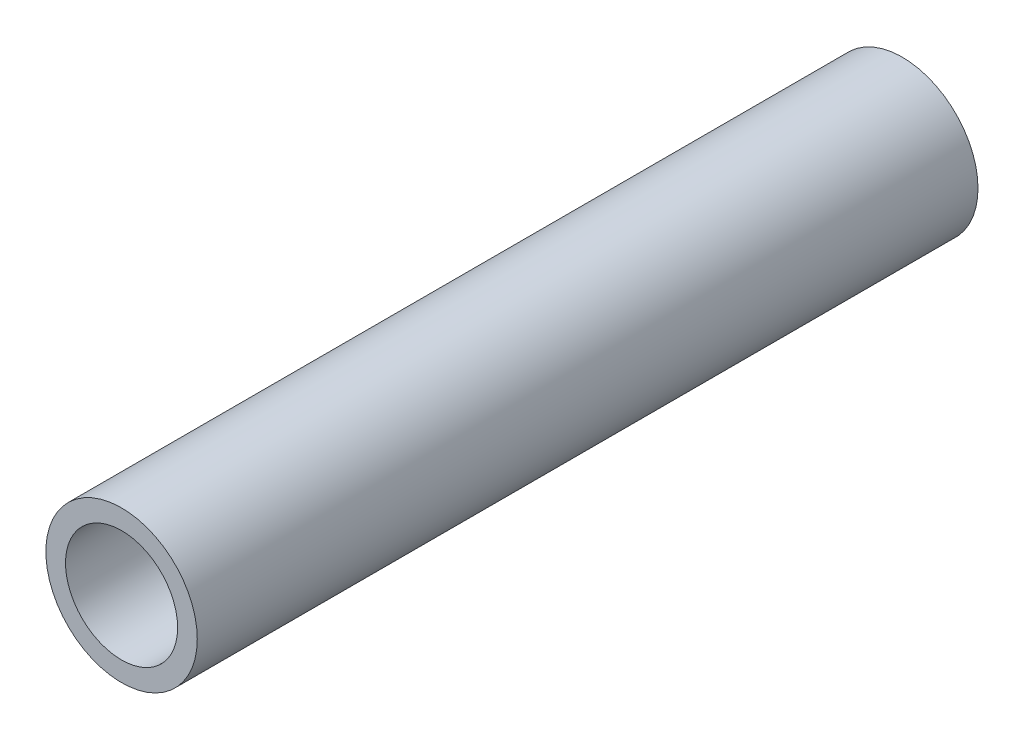
ISO-10303-21;
HEADER;
FILE_DESCRIPTION(('STEP AP214'),'2;1');
FILE_NAME('part.step','',(''),(''),'','','');
FILE_SCHEMA(('AUTOMOTIVE_DESIGN { 1 0 10303 214 1 1 1 1 }'));
ENDSEC;
DATA;
#1=APPLICATION_CONTEXT('core data for automotive mechanical design processes');
#2=APPLICATION_PROTOCOL_DEFINITION('international standard','automotive_design',2000,#1);
#3=PRODUCT_CONTEXT('',#1,'mechanical');
#4=PRODUCT('Part','Part','',(#3));
#5=PRODUCT_RELATED_PRODUCT_CATEGORY('part','',(#4));
#6=PRODUCT_DEFINITION_FORMATION('','',#4);
#7=PRODUCT_DEFINITION_CONTEXT('part definition',#1,'design');
#8=PRODUCT_DEFINITION('design','',#6,#7);
#9=PRODUCT_DEFINITION_SHAPE('','',#8);
#10=(LENGTH_UNIT() NAMED_UNIT(*) SI_UNIT(.MILLI.,.METRE.));
#11=(NAMED_UNIT(*) PLANE_ANGLE_UNIT() SI_UNIT($,.RADIAN.));
#12=(NAMED_UNIT(*) SI_UNIT($,.STERADIAN.) SOLID_ANGLE_UNIT());
#13=UNCERTAINTY_MEASURE_WITH_UNIT(LENGTH_MEASURE(1.E-05),#10,'distance_accuracy_value','');
#14=(GEOMETRIC_REPRESENTATION_CONTEXT(3) GLOBAL_UNCERTAINTY_ASSIGNED_CONTEXT((#13)) GLOBAL_UNIT_ASSIGNED_CONTEXT((#10,
#11,#12)) REPRESENTATION_CONTEXT('',''));
#15=CARTESIAN_POINT('',(0.,0.,0.));
#16=DIRECTION('',(0.,0.,1.));
#17=DIRECTION('',(1.,0.,0.));
#18=AXIS2_PLACEMENT_3D('',#15,#16,#17);
#19=CARTESIAN_POINT('',(0.,0.,55.));
#20=DIRECTION('',(0.,0.,1.));
#21=DIRECTION('',(1.,0.,0.));
#22=AXIS2_PLACEMENT_3D('',#19,#20,#21);
#23=PLANE('',#22);
#24=CARTESIAN_POINT('',(0.,0.,55.));
#25=DIRECTION('',(0.,0.,1.));
#26=DIRECTION('',(1.,0.,0.));
#27=AXIS2_PLACEMENT_3D('',#24,#25,#26);
#28=CIRCLE('',#27,10.668);
#29=CARTESIAN_POINT('',(10.668,0.,55.));
#30=VERTEX_POINT('',#29);
#31=EDGE_CURVE('E11',#30,#30,#28,.T.);
#32=ORIENTED_EDGE('',*,*,#31,.T.);
#33=EDGE_LOOP('',(#32));
#34=FACE_BOUND('',#33,.T.);
#35=CARTESIAN_POINT('',(0.,0.,55.));
#36=DIRECTION('',(0.,0.,1.));
#37=DIRECTION('',(1.,0.,0.));
#38=AXIS2_PLACEMENT_3D('',#35,#36,#37);
#39=CIRCLE('',#38,7.8994);
#40=CARTESIAN_POINT('',(7.8994,0.,55.));
#41=VERTEX_POINT('',#40);
#42=EDGE_CURVE('E56',#41,#41,#39,.T.);
#43=ORIENTED_EDGE('',*,*,#42,.F.);
#44=EDGE_LOOP('',(#43));
#45=FACE_BOUND('',#44,.T.);
#46=ADVANCED_FACE('F43',(#34,#45),#23,.T.);
#47=CARTESIAN_POINT('',(0.,0.,-55.));
#48=DIRECTION('',(0.,0.,1.));
#49=DIRECTION('',(1.,0.,0.));
#50=AXIS2_PLACEMENT_3D('',#47,#48,#49);
#51=PLANE('',#50);
#52=CARTESIAN_POINT('',(0.,0.,-55.));
#53=DIRECTION('',(0.,0.,1.));
#54=DIRECTION('',(1.,0.,0.));
#55=AXIS2_PLACEMENT_3D('',#52,#53,#54);
#56=CIRCLE('',#55,10.668);
#57=CARTESIAN_POINT('',(10.668,0.,-55.));
#58=VERTEX_POINT('',#57);
#59=EDGE_CURVE('E47',#58,#58,#56,.T.);
#60=ORIENTED_EDGE('',*,*,#59,.F.);
#61=EDGE_LOOP('',(#60));
#62=FACE_BOUND('',#61,.T.);
#63=CARTESIAN_POINT('',(0.,0.,-55.));
#64=DIRECTION('',(0.,0.,1.));
#65=DIRECTION('',(1.,0.,0.));
#66=AXIS2_PLACEMENT_3D('',#63,#64,#65);
#67=CIRCLE('',#66,7.8994);
#68=CARTESIAN_POINT('',(7.8994,0.,-55.));
#69=VERTEX_POINT('',#68);
#70=EDGE_CURVE('E58',#69,#69,#67,.T.);
#71=ORIENTED_EDGE('',*,*,#70,.T.);
#72=EDGE_LOOP('',(#71));
#73=FACE_BOUND('',#72,.T.);
#74=ADVANCED_FACE('F70',(#62,#73),#51,.F.);
#75=CARTESIAN_POINT('',(0.,0.,55.));
#76=DIRECTION('',(0.,0.,-1.));
#77=DIRECTION('',(-1.,0.,0.));
#78=AXIS2_PLACEMENT_3D('',#75,#76,#77);
#79=CYLINDRICAL_SURFACE('',#78,10.668);
#80=ORIENTED_EDGE('',*,*,#31,.F.);
#81=EDGE_LOOP('',(#80));
#82=FACE_BOUND('',#81,.T.);
#83=ORIENTED_EDGE('',*,*,#59,.T.);
#84=EDGE_LOOP('',(#83));
#85=FACE_BOUND('',#84,.T.);
#86=ADVANCED_FACE('F45',(#82,#85),#79,.T.);
#87=CARTESIAN_POINT('',(0.,0.,55.));
#88=DIRECTION('',(0.,0.,-1.));
#89=DIRECTION('',(-1.,0.,0.));
#90=AXIS2_PLACEMENT_3D('',#87,#88,#89);
#91=CYLINDRICAL_SURFACE('',#90,7.8994);
#92=ORIENTED_EDGE('',*,*,#42,.T.);
#93=EDGE_LOOP('',(#92));
#94=FACE_BOUND('',#93,.T.);
#95=ORIENTED_EDGE('',*,*,#70,.F.);
#96=EDGE_LOOP('',(#95));
#97=FACE_BOUND('',#96,.T.);
#98=ADVANCED_FACE('F66',(#94,#97),#91,.F.);
#99=CLOSED_SHELL('',(#46,#74,#86,#98));
#100=MANIFOLD_SOLID_BREP('B2',#99);
#101=ADVANCED_BREP_SHAPE_REPRESENTATION('',(#18,#100),#14);
#102=SHAPE_DEFINITION_REPRESENTATION(#9,#101);
ENDSEC;
END-ISO-10303-21;
